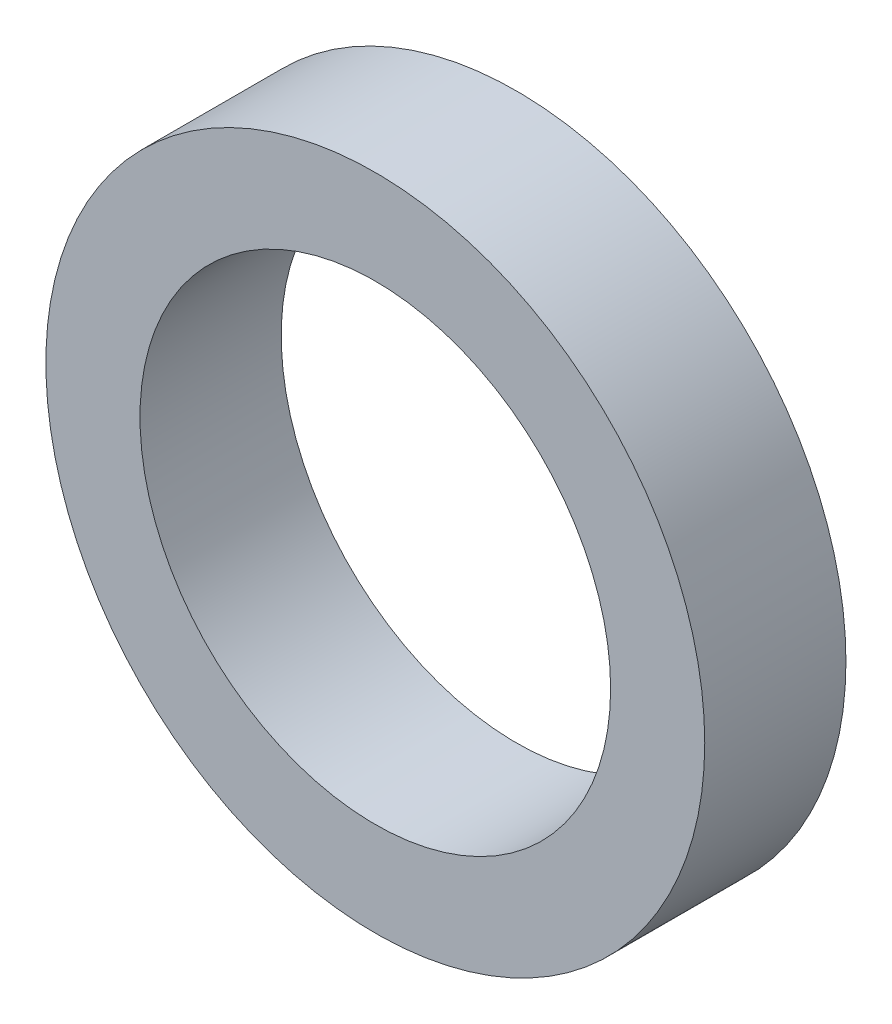
ISO-10303-21;
HEADER;
FILE_DESCRIPTION(('STEP AP214'),'2;1');
FILE_NAME('part.step','',(''),(''),'','','');
FILE_SCHEMA(('AUTOMOTIVE_DESIGN { 1 0 10303 214 1 1 1 1 }'));
ENDSEC;
DATA;
#1=APPLICATION_CONTEXT('core data for automotive mechanical design processes');
#2=APPLICATION_PROTOCOL_DEFINITION('international standard','automotive_design',2000,#1);
#3=PRODUCT_CONTEXT('',#1,'mechanical');
#4=PRODUCT('Part','Part','',(#3));
#5=PRODUCT_RELATED_PRODUCT_CATEGORY('part','',(#4));
#6=PRODUCT_DEFINITION_FORMATION('','',#4);
#7=PRODUCT_DEFINITION_CONTEXT('part definition',#1,'design');
#8=PRODUCT_DEFINITION('design','',#6,#7);
#9=PRODUCT_DEFINITION_SHAPE('','',#8);
#10=(LENGTH_UNIT() NAMED_UNIT(*) SI_UNIT(.MILLI.,.METRE.));
#11=(NAMED_UNIT(*) PLANE_ANGLE_UNIT() SI_UNIT($,.RADIAN.));
#12=(NAMED_UNIT(*) SI_UNIT($,.STERADIAN.) SOLID_ANGLE_UNIT());
#13=UNCERTAINTY_MEASURE_WITH_UNIT(LENGTH_MEASURE(1.E-05),#10,'distance_accuracy_value','');
#14=(GEOMETRIC_REPRESENTATION_CONTEXT(3) GLOBAL_UNCERTAINTY_ASSIGNED_CONTEXT((#13)) GLOBAL_UNIT_ASSIGNED_CONTEXT((#10,
#11,#12)) REPRESENTATION_CONTEXT('',''));
#15=CARTESIAN_POINT('',(0.,0.,0.));
#16=DIRECTION('',(0.,0.,1.));
#17=DIRECTION('',(1.,0.,0.));
#18=AXIS2_PLACEMENT_3D('',#15,#16,#17);
#19=CARTESIAN_POINT('',(0.,0.,0.9));
#20=DIRECTION('',(0.,0.,1.));
#21=DIRECTION('',(1.,0.,0.));
#22=AXIS2_PLACEMENT_3D('',#19,#20,#21);
#23=PLANE('',#22);
#24=CARTESIAN_POINT('',(0.,0.,0.9));
#25=DIRECTION('',(0.,0.,1.));
#26=DIRECTION('',(1.,0.,0.));
#27=AXIS2_PLACEMENT_3D('',#24,#25,#26);
#28=CIRCLE('',#27,2.1);
#29=CARTESIAN_POINT('',(2.1,0.,0.9));
#30=VERTEX_POINT('',#29);
#31=EDGE_CURVE('E10',#30,#30,#28,.T.);
#32=ORIENTED_EDGE('',*,*,#31,.T.);
#33=EDGE_LOOP('',(#32));
#34=FACE_BOUND('',#33,.T.);
#35=CARTESIAN_POINT('',(0.,0.,0.9));
#36=DIRECTION('',(0.,0.,1.));
#37=DIRECTION('',(1.,0.,0.));
#38=AXIS2_PLACEMENT_3D('',#35,#36,#37);
#39=CIRCLE('',#38,1.5);
#40=CARTESIAN_POINT('',(1.5,0.,0.9));
#41=VERTEX_POINT('',#40);
#42=EDGE_CURVE('E43',#41,#41,#39,.T.);
#43=ORIENTED_EDGE('',*,*,#42,.F.);
#44=EDGE_LOOP('',(#43));
#45=FACE_BOUND('',#44,.T.);
#46=ADVANCED_FACE('F32',(#34,#45),#23,.T.);
#47=CARTESIAN_POINT('',(0.,0.,0.));
#48=DIRECTION('',(0.,0.,1.));
#49=DIRECTION('',(1.,0.,0.));
#50=AXIS2_PLACEMENT_3D('',#47,#48,#49);
#51=PLANE('',#50);
#52=CARTESIAN_POINT('',(0.,0.,0.));
#53=DIRECTION('',(0.,0.,1.));
#54=DIRECTION('',(1.,0.,0.));
#55=AXIS2_PLACEMENT_3D('',#52,#53,#54);
#56=CIRCLE('',#55,2.1);
#57=CARTESIAN_POINT('',(2.1,0.,0.));
#58=VERTEX_POINT('',#57);
#59=EDGE_CURVE('E36',#58,#58,#56,.T.);
#60=ORIENTED_EDGE('',*,*,#59,.F.);
#61=EDGE_LOOP('',(#60));
#62=FACE_BOUND('',#61,.T.);
#63=CARTESIAN_POINT('',(0.,0.,0.));
#64=DIRECTION('',(0.,0.,1.));
#65=DIRECTION('',(1.,0.,0.));
#66=AXIS2_PLACEMENT_3D('',#63,#64,#65);
#67=CIRCLE('',#66,1.5);
#68=CARTESIAN_POINT('',(1.5,0.,0.));
#69=VERTEX_POINT('',#68);
#70=EDGE_CURVE('E45',#69,#69,#67,.T.);
#71=ORIENTED_EDGE('',*,*,#70,.T.);
#72=EDGE_LOOP('',(#71));
#73=FACE_BOUND('',#72,.T.);
#74=ADVANCED_FACE('F55',(#62,#73),#51,.F.);
#75=CARTESIAN_POINT('',(0.,0.,0.9));
#76=DIRECTION('',(0.,0.,-1.));
#77=DIRECTION('',(-1.,0.,0.));
#78=AXIS2_PLACEMENT_3D('',#75,#76,#77);
#79=CYLINDRICAL_SURFACE('',#78,2.1);
#80=ORIENTED_EDGE('',*,*,#31,.F.);
#81=EDGE_LOOP('',(#80));
#82=FACE_BOUND('',#81,.T.);
#83=ORIENTED_EDGE('',*,*,#59,.T.);
#84=EDGE_LOOP('',(#83));
#85=FACE_BOUND('',#84,.T.);
#86=ADVANCED_FACE('F34',(#82,#85),#79,.T.);
#87=CARTESIAN_POINT('',(0.,0.,0.9));
#88=DIRECTION('',(0.,0.,-1.));
#89=DIRECTION('',(-1.,0.,0.));
#90=AXIS2_PLACEMENT_3D('',#87,#88,#89);
#91=CYLINDRICAL_SURFACE('',#90,1.5);
#92=ORIENTED_EDGE('',*,*,#42,.T.);
#93=EDGE_LOOP('',(#92));
#94=FACE_BOUND('',#93,.T.);
#95=ORIENTED_EDGE('',*,*,#70,.F.);
#96=EDGE_LOOP('',(#95));
#97=FACE_BOUND('',#96,.T.);
#98=ADVANCED_FACE('F51',(#94,#97),#91,.F.);
#99=CLOSED_SHELL('',(#46,#74,#86,#98));
#100=MANIFOLD_SOLID_BREP('B2',#99);
#101=ADVANCED_BREP_SHAPE_REPRESENTATION('',(#18,#100),#14);
#102=SHAPE_DEFINITION_REPRESENTATION(#9,#101);
ENDSEC;
END-ISO-10303-21;
